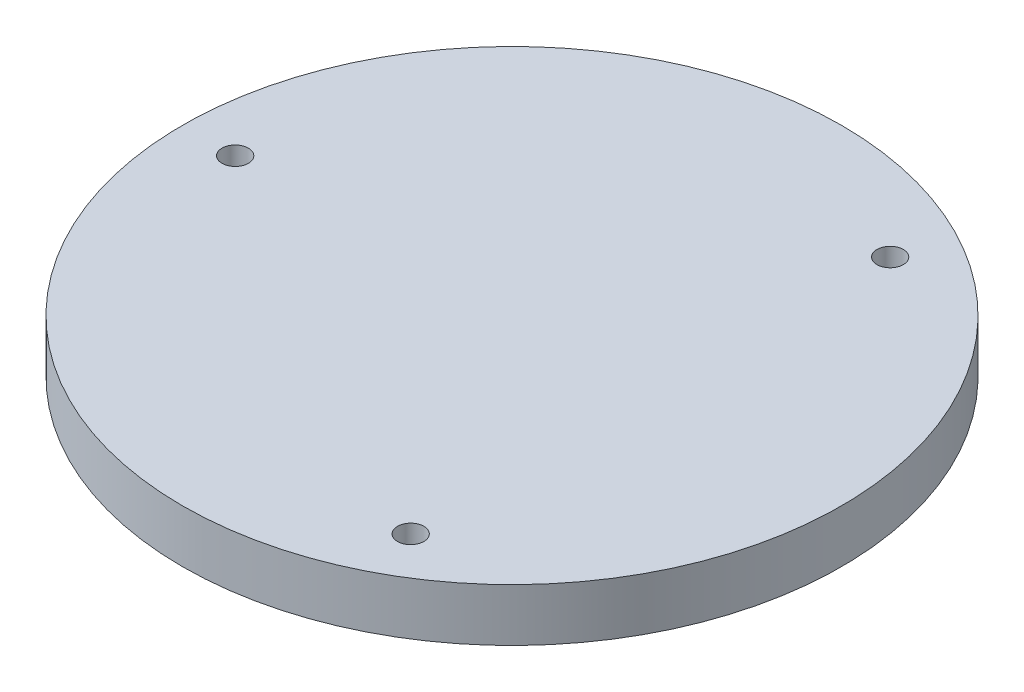
ISO-10303-21;
HEADER;
FILE_DESCRIPTION(('STEP AP214'),'2;1');
FILE_NAME('part.step','',(''),(''),'','','');
FILE_SCHEMA(('AUTOMOTIVE_DESIGN { 1 0 10303 214 1 1 1 1 }'));
ENDSEC;
DATA;
#1=APPLICATION_CONTEXT('core data for automotive mechanical design processes');
#2=APPLICATION_PROTOCOL_DEFINITION('international standard','automotive_design',2000,#1);
#3=PRODUCT_CONTEXT('',#1,'mechanical');
#4=PRODUCT('Part','Part','',(#3));
#5=PRODUCT_RELATED_PRODUCT_CATEGORY('part','',(#4));
#6=PRODUCT_DEFINITION_FORMATION('','',#4);
#7=PRODUCT_DEFINITION_CONTEXT('part definition',#1,'design');
#8=PRODUCT_DEFINITION('design','',#6,#7);
#9=PRODUCT_DEFINITION_SHAPE('','',#8);
#10=(LENGTH_UNIT() NAMED_UNIT(*) SI_UNIT(.MILLI.,.METRE.));
#11=(NAMED_UNIT(*) PLANE_ANGLE_UNIT() SI_UNIT($,.RADIAN.));
#12=(NAMED_UNIT(*) SI_UNIT($,.STERADIAN.) SOLID_ANGLE_UNIT());
#13=UNCERTAINTY_MEASURE_WITH_UNIT(LENGTH_MEASURE(1.E-05),#10,'distance_accuracy_value','');
#14=(GEOMETRIC_REPRESENTATION_CONTEXT(3) GLOBAL_UNCERTAINTY_ASSIGNED_CONTEXT((#13)) GLOBAL_UNIT_ASSIGNED_CONTEXT((#10,
#11,#12)) REPRESENTATION_CONTEXT('',''));
#15=CARTESIAN_POINT('',(0.,0.,0.));
#16=DIRECTION('',(0.,0.,1.));
#17=DIRECTION('',(1.,0.,0.));
#18=AXIS2_PLACEMENT_3D('',#15,#16,#17);
#19=CARTESIAN_POINT('',(0.,20.,0.));
#20=DIRECTION('',(0.,-1.,0.));
#21=DIRECTION('',(0.,0.,-1.));
#22=AXIS2_PLACEMENT_3D('',#19,#20,#21);
#23=CYLINDRICAL_SURFACE('',#22,125.);
#24=CARTESIAN_POINT('',(0.,20.,0.));
#25=DIRECTION('',(0.,1.,0.));
#26=DIRECTION('',(0.,0.,1.));
#27=AXIS2_PLACEMENT_3D('',#24,#25,#26);
#28=CIRCLE('',#27,125.);
#29=CARTESIAN_POINT('',(0.,20.,125.));
#30=VERTEX_POINT('',#29);
#31=EDGE_CURVE('E10',#30,#30,#28,.T.);
#32=ORIENTED_EDGE('',*,*,#31,.F.);
#33=EDGE_LOOP('',(#32));
#34=FACE_BOUND('',#33,.T.);
#35=CARTESIAN_POINT('',(0.,0.,0.));
#36=DIRECTION('',(0.,1.,0.));
#37=DIRECTION('',(0.,0.,1.));
#38=AXIS2_PLACEMENT_3D('',#35,#36,#37);
#39=CIRCLE('',#38,125.);
#40=CARTESIAN_POINT('',(0.,0.,125.));
#41=VERTEX_POINT('',#40);
#42=EDGE_CURVE('E43',#41,#41,#39,.T.);
#43=ORIENTED_EDGE('',*,*,#42,.T.);
#44=EDGE_LOOP('',(#43));
#45=FACE_BOUND('',#44,.T.);
#46=ADVANCED_FACE('F40',(#34,#45),#23,.T.);
#47=CARTESIAN_POINT('',(0.,20.,0.));
#48=DIRECTION('',(0.,1.,0.));
#49=DIRECTION('',(0.,0.,1.));
#50=AXIS2_PLACEMENT_3D('',#47,#48,#49);
#51=PLANE('',#50);
#52=CARTESIAN_POINT('',(52.5000000000004,20.,90.9326673973658));
#53=DIRECTION('',(0.,1.,0.));
#54=DIRECTION('',(0.866025403784436,0.,-0.500000000000004));
#55=AXIS2_PLACEMENT_3D('',#52,#53,#54);
#56=CIRCLE('',#55,5.);
#57=CARTESIAN_POINT('',(56.8301270189226,20.,88.4326673973658));
#58=VERTEX_POINT('',#57);
#59=EDGE_CURVE('E75',#58,#58,#56,.T.);
#60=ORIENTED_EDGE('',*,*,#59,.F.);
#61=EDGE_LOOP('',(#60));
#62=FACE_BOUND('',#61,.T.);
#63=CARTESIAN_POINT('',(52.4999999999992,20.,-90.9326673973665));
#64=DIRECTION('',(0.,1.,0.));
#65=DIRECTION('',(-0.866025403784443,0.,-0.499999999999992));
#66=AXIS2_PLACEMENT_3D('',#63,#64,#65);
#67=CIRCLE('',#66,5.);
#68=CARTESIAN_POINT('',(48.1698729810769,20.,-93.4326673973665));
#69=VERTEX_POINT('',#68);
#70=EDGE_CURVE('E84',#69,#69,#67,.T.);
#71=ORIENTED_EDGE('',*,*,#70,.F.);
#72=EDGE_LOOP('',(#71));
#73=FACE_BOUND('',#72,.T.);
#74=CARTESIAN_POINT('',(-105.,20.,0.));
#75=DIRECTION('',(0.,1.,0.));
#76=DIRECTION('',(0.,0.,1.));
#77=AXIS2_PLACEMENT_3D('',#74,#75,#76);
#78=CIRCLE('',#77,5.);
#79=CARTESIAN_POINT('',(-105.,20.,5.));
#80=VERTEX_POINT('',#79);
#81=EDGE_CURVE('E66',#80,#80,#78,.T.);
#82=ORIENTED_EDGE('',*,*,#81,.F.);
#83=EDGE_LOOP('',(#82));
#84=FACE_BOUND('',#83,.T.);
#85=ORIENTED_EDGE('',*,*,#31,.T.);
#86=EDGE_LOOP('',(#85));
#87=FACE_BOUND('',#86,.T.);
#88=ADVANCED_FACE('F106',(#62,#73,#84,#87),#51,.T.);
#89=CARTESIAN_POINT('',(0.,0.,0.));
#90=DIRECTION('',(0.,1.,0.));
#91=DIRECTION('',(0.,0.,1.));
#92=AXIS2_PLACEMENT_3D('',#89,#90,#91);
#93=PLANE('',#92);
#94=CARTESIAN_POINT('',(52.5000000000004,0.,90.9326673973658));
#95=DIRECTION('',(0.,1.,0.));
#96=DIRECTION('',(0.866025403784436,0.,-0.500000000000004));
#97=AXIS2_PLACEMENT_3D('',#94,#95,#96);
#98=CIRCLE('',#97,2.65);
#99=CARTESIAN_POINT('',(54.7949673200292,0.,89.6076673973658));
#100=VERTEX_POINT('',#99);
#101=EDGE_CURVE('E95',#100,#100,#98,.T.);
#102=ORIENTED_EDGE('',*,*,#101,.T.);
#103=EDGE_LOOP('',(#102));
#104=FACE_BOUND('',#103,.T.);
#105=CARTESIAN_POINT('',(52.4999999999992,0.,-90.9326673973665));
#106=DIRECTION('',(0.,1.,0.));
#107=DIRECTION('',(-0.866025403784443,0.,-0.499999999999992));
#108=AXIS2_PLACEMENT_3D('',#105,#106,#107);
#109=CIRCLE('',#108,2.65);
#110=CARTESIAN_POINT('',(50.2050326799704,0.,-92.2576673973665));
#111=VERTEX_POINT('',#110);
#112=EDGE_CURVE('E80',#111,#111,#109,.T.);
#113=ORIENTED_EDGE('',*,*,#112,.T.);
#114=EDGE_LOOP('',(#113));
#115=FACE_BOUND('',#114,.T.);
#116=CARTESIAN_POINT('',(-105.,0.,0.));
#117=DIRECTION('',(0.,1.,0.));
#118=DIRECTION('',(0.,0.,1.));
#119=AXIS2_PLACEMENT_3D('',#116,#117,#118);
#120=CIRCLE('',#119,2.65);
#121=CARTESIAN_POINT('',(-105.,0.,2.65));
#122=VERTEX_POINT('',#121);
#123=EDGE_CURVE('E53',#122,#122,#120,.T.);
#124=ORIENTED_EDGE('',*,*,#123,.T.);
#125=EDGE_LOOP('',(#124));
#126=FACE_BOUND('',#125,.T.);
#127=ORIENTED_EDGE('',*,*,#42,.F.);
#128=EDGE_LOOP('',(#127));
#129=FACE_BOUND('',#128,.T.);
#130=ADVANCED_FACE('F109',(#104,#115,#126,#129),#93,.F.);
#131=CARTESIAN_POINT('',(-105.,20.,0.));
#132=DIRECTION('',(0.,1.,0.));
#133=DIRECTION('',(0.,0.,1.));
#134=AXIS2_PLACEMENT_3D('',#131,#132,#133);
#135=CYLINDRICAL_SURFACE('',#134,2.65);
#136=ORIENTED_EDGE('',*,*,#123,.F.);
#137=EDGE_LOOP('',(#136));
#138=FACE_BOUND('',#137,.T.);
#139=CARTESIAN_POINT('',(-105.,4.6,0.));
#140=DIRECTION('',(0.,1.,0.));
#141=DIRECTION('',(0.,0.,1.));
#142=AXIS2_PLACEMENT_3D('',#139,#140,#141);
#143=CIRCLE('',#142,2.65);
#144=CARTESIAN_POINT('',(-105.,4.6,2.65));
#145=VERTEX_POINT('',#144);
#146=EDGE_CURVE('E58',#145,#145,#143,.T.);
#147=ORIENTED_EDGE('',*,*,#146,.T.);
#148=EDGE_LOOP('',(#147));
#149=FACE_BOUND('',#148,.T.);
#150=ADVANCED_FACE('F128',(#138,#149),#135,.F.);
#151=CARTESIAN_POINT('',(-102.35,4.6,0.));
#152=DIRECTION('',(0.,-1.,0.));
#153=DIRECTION('',(0.,0.,-1.));
#154=AXIS2_PLACEMENT_3D('',#151,#152,#153);
#155=PLANE('',#154);
#156=ORIENTED_EDGE('',*,*,#146,.F.);
#157=EDGE_LOOP('',(#156));
#158=FACE_BOUND('',#157,.T.);
#159=CARTESIAN_POINT('',(-105.,4.6,0.));
#160=DIRECTION('',(0.,1.,0.));
#161=DIRECTION('',(0.,0.,1.));
#162=AXIS2_PLACEMENT_3D('',#159,#160,#161);
#163=CIRCLE('',#162,4.99999999999999);
#164=CARTESIAN_POINT('',(-105.,4.6,4.99999999999999));
#165=VERTEX_POINT('',#164);
#166=EDGE_CURVE('E62',#165,#165,#163,.T.);
#167=ORIENTED_EDGE('',*,*,#166,.T.);
#168=EDGE_LOOP('',(#167));
#169=FACE_BOUND('',#168,.T.);
#170=ADVANCED_FACE('F118',(#158,#169),#155,.F.);
#171=CARTESIAN_POINT('',(-105.,20.,0.));
#172=DIRECTION('',(0.,1.,0.));
#173=DIRECTION('',(0.,0.,1.));
#174=AXIS2_PLACEMENT_3D('',#171,#172,#173);
#175=CYLINDRICAL_SURFACE('',#174,5.);
#176=ORIENTED_EDGE('',*,*,#166,.F.);
#177=EDGE_LOOP('',(#176));
#178=FACE_BOUND('',#177,.T.);
#179=ORIENTED_EDGE('',*,*,#81,.T.);
#180=EDGE_LOOP('',(#179));
#181=FACE_BOUND('',#180,.T.);
#182=ADVANCED_FACE('F115',(#178,#181),#175,.F.);
#183=CARTESIAN_POINT('',(52.4999999999992,20.,-90.9326673973665));
#184=DIRECTION('',(0.,1.,0.));
#185=DIRECTION('',(-0.866025403784443,0.,-0.499999999999992));
#186=AXIS2_PLACEMENT_3D('',#183,#184,#185);
#187=CYLINDRICAL_SURFACE('',#186,2.65);
#188=ORIENTED_EDGE('',*,*,#112,.F.);
#189=EDGE_LOOP('',(#188));
#190=FACE_BOUND('',#189,.T.);
#191=CARTESIAN_POINT('',(52.4999999999992,4.6,-90.9326673973665));
#192=DIRECTION('',(0.,1.,0.));
#193=DIRECTION('',(-0.866025403784443,0.,-0.499999999999992));
#194=AXIS2_PLACEMENT_3D('',#191,#192,#193);
#195=CIRCLE('',#194,2.65);
#196=CARTESIAN_POINT('',(50.2050326799704,4.6,-92.2576673973665));
#197=VERTEX_POINT('',#196);
#198=EDGE_CURVE('E71',#197,#197,#195,.T.);
#199=ORIENTED_EDGE('',*,*,#198,.T.);
#200=EDGE_LOOP('',(#199));
#201=FACE_BOUND('',#200,.T.);
#202=ADVANCED_FACE('F117',(#190,#201),#187,.F.);
#203=CARTESIAN_POINT('',(51.1749999999992,4.6,-88.6377000773378));
#204=DIRECTION('',(0.,-1.,0.));
#205=DIRECTION('',(0.866025403784443,0.,0.499999999999992));
#206=AXIS2_PLACEMENT_3D('',#203,#204,#205);
#207=PLANE('',#206);
#208=ORIENTED_EDGE('',*,*,#198,.F.);
#209=EDGE_LOOP('',(#208));
#210=FACE_BOUND('',#209,.T.);
#211=CARTESIAN_POINT('',(52.4999999999992,4.6,-90.9326673973665));
#212=DIRECTION('',(0.,1.,0.));
#213=DIRECTION('',(-0.866025403784443,0.,-0.499999999999992));
#214=AXIS2_PLACEMENT_3D('',#211,#212,#213);
#215=CIRCLE('',#214,4.99999999999999);
#216=CARTESIAN_POINT('',(48.1698729810769,4.6,-93.4326673973665));
#217=VERTEX_POINT('',#216);
#218=EDGE_CURVE('E76',#217,#217,#215,.T.);
#219=ORIENTED_EDGE('',*,*,#218,.T.);
#220=EDGE_LOOP('',(#219));
#221=FACE_BOUND('',#220,.T.);
#222=ADVANCED_FACE('F125',(#210,#221),#207,.F.);
#223=CARTESIAN_POINT('',(52.4999999999992,20.,-90.9326673973665));
#224=DIRECTION('',(0.,1.,0.));
#225=DIRECTION('',(-0.866025403784443,0.,-0.499999999999992));
#226=AXIS2_PLACEMENT_3D('',#223,#224,#225);
#227=CYLINDRICAL_SURFACE('',#226,5.);
#228=ORIENTED_EDGE('',*,*,#218,.F.);
#229=EDGE_LOOP('',(#228));
#230=FACE_BOUND('',#229,.T.);
#231=ORIENTED_EDGE('',*,*,#70,.T.);
#232=EDGE_LOOP('',(#231));
#233=FACE_BOUND('',#232,.T.);
#234=ADVANCED_FACE('F159',(#230,#233),#227,.F.);
#235=CARTESIAN_POINT('',(52.5000000000004,20.,90.9326673973658));
#236=DIRECTION('',(0.,1.,0.));
#237=DIRECTION('',(0.866025403784436,0.,-0.500000000000004));
#238=AXIS2_PLACEMENT_3D('',#235,#236,#237);
#239=CYLINDRICAL_SURFACE('',#238,2.65);
#240=ORIENTED_EDGE('',*,*,#101,.F.);
#241=EDGE_LOOP('',(#240));
#242=FACE_BOUND('',#241,.T.);
#243=CARTESIAN_POINT('',(52.5000000000004,4.6,90.9326673973658));
#244=DIRECTION('',(0.,1.,0.));
#245=DIRECTION('',(0.866025403784436,0.,-0.500000000000004));
#246=AXIS2_PLACEMENT_3D('',#243,#244,#245);
#247=CIRCLE('',#246,2.65);
#248=CARTESIAN_POINT('',(54.7949673200292,4.6,89.6076673973658));
#249=VERTEX_POINT('',#248);
#250=EDGE_CURVE('E70',#249,#249,#247,.T.);
#251=ORIENTED_EDGE('',*,*,#250,.T.);
#252=EDGE_LOOP('',(#251));
#253=FACE_BOUND('',#252,.T.);
#254=ADVANCED_FACE('F165',(#242,#253),#239,.F.);
#255=CARTESIAN_POINT('',(51.1750000000004,4.6,88.6377000773371));
#256=DIRECTION('',(0.,-1.,0.));
#257=DIRECTION('',(-0.866025403784436,0.,0.500000000000004));
#258=AXIS2_PLACEMENT_3D('',#255,#256,#257);
#259=PLANE('',#258);
#260=ORIENTED_EDGE('',*,*,#250,.F.);
#261=EDGE_LOOP('',(#260));
#262=FACE_BOUND('',#261,.T.);
#263=CARTESIAN_POINT('',(52.5000000000004,4.6,90.9326673973658));
#264=DIRECTION('',(0.,1.,0.));
#265=DIRECTION('',(0.866025403784436,0.,-0.500000000000004));
#266=AXIS2_PLACEMENT_3D('',#263,#264,#265);
#267=CIRCLE('',#266,4.99999999999999);
#268=CARTESIAN_POINT('',(56.8301270189226,4.6,88.4326673973658));
#269=VERTEX_POINT('',#268);
#270=EDGE_CURVE('E91',#269,#269,#267,.T.);
#271=ORIENTED_EDGE('',*,*,#270,.T.);
#272=EDGE_LOOP('',(#271));
#273=FACE_BOUND('',#272,.T.);
#274=ADVANCED_FACE('F170',(#262,#273),#259,.F.);
#275=CARTESIAN_POINT('',(52.5000000000004,20.,90.9326673973658));
#276=DIRECTION('',(0.,1.,0.));
#277=DIRECTION('',(0.866025403784436,0.,-0.500000000000004));
#278=AXIS2_PLACEMENT_3D('',#275,#276,#277);
#279=CYLINDRICAL_SURFACE('',#278,5.);
#280=ORIENTED_EDGE('',*,*,#270,.F.);
#281=EDGE_LOOP('',(#280));
#282=FACE_BOUND('',#281,.T.);
#283=ORIENTED_EDGE('',*,*,#59,.T.);
#284=EDGE_LOOP('',(#283));
#285=FACE_BOUND('',#284,.T.);
#286=ADVANCED_FACE('F104',(#282,#285),#279,.F.);
#287=CLOSED_SHELL('',(#46,#88,#130,#150,#170,#182,#202,#222,#234,#254,#274,#286));
#288=MANIFOLD_SOLID_BREP('B2',#287);
#289=ADVANCED_BREP_SHAPE_REPRESENTATION('',(#18,#288),#14);
#290=SHAPE_DEFINITION_REPRESENTATION(#9,#289);
ENDSEC;
END-ISO-10303-21;
